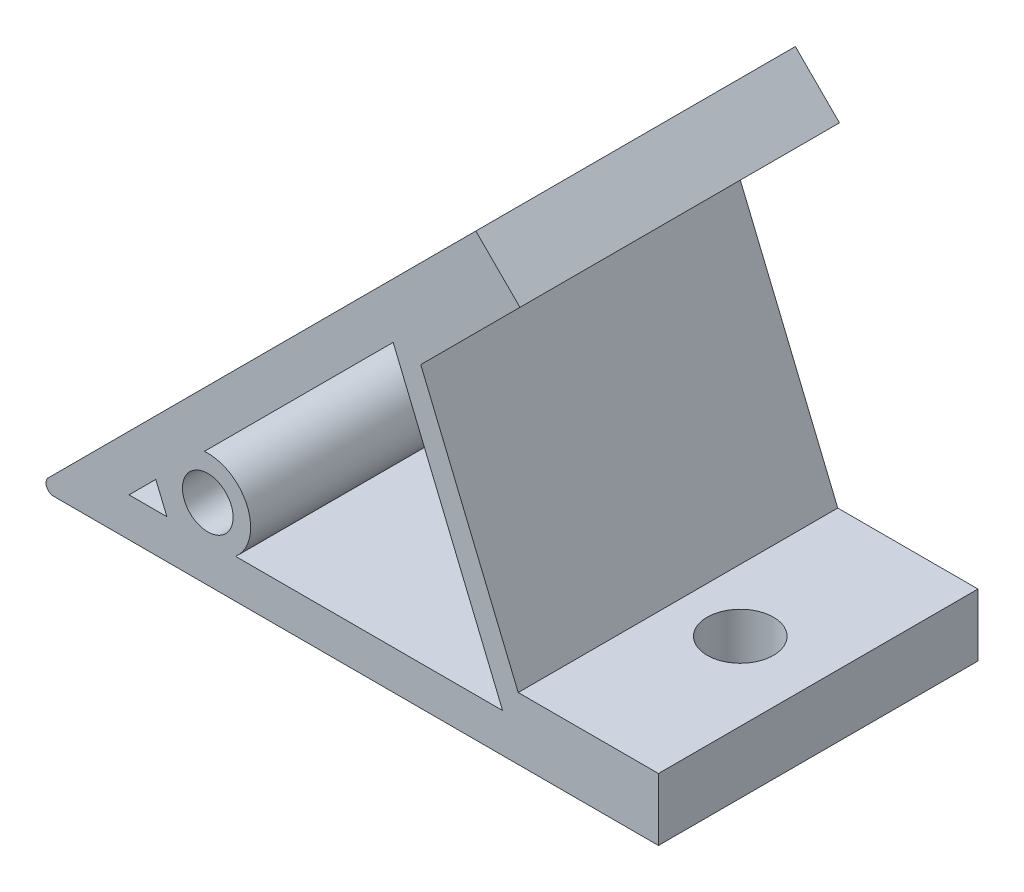
ISO-10303-21;
HEADER;
FILE_DESCRIPTION(('STEP AP214'),'2;1');
FILE_NAME('part.step','',(''),(''),'','','');
FILE_SCHEMA(('AUTOMOTIVE_DESIGN { 1 0 10303 214 1 1 1 1 }'));
ENDSEC;
DATA;
#1=APPLICATION_CONTEXT('core data for automotive mechanical design processes');
#2=APPLICATION_PROTOCOL_DEFINITION('international standard','automotive_design',2000,#1);
#3=PRODUCT_CONTEXT('',#1,'mechanical');
#4=PRODUCT('Part','Part','',(#3));
#5=PRODUCT_RELATED_PRODUCT_CATEGORY('part','',(#4));
#6=PRODUCT_DEFINITION_FORMATION('','',#4);
#7=PRODUCT_DEFINITION_CONTEXT('part definition',#1,'design');
#8=PRODUCT_DEFINITION('design','',#6,#7);
#9=PRODUCT_DEFINITION_SHAPE('','',#8);
#10=(LENGTH_UNIT() NAMED_UNIT(*) SI_UNIT(.MILLI.,.METRE.));
#11=(NAMED_UNIT(*) PLANE_ANGLE_UNIT() SI_UNIT($,.RADIAN.));
#12=(NAMED_UNIT(*) SI_UNIT($,.STERADIAN.) SOLID_ANGLE_UNIT());
#13=UNCERTAINTY_MEASURE_WITH_UNIT(LENGTH_MEASURE(1.E-05),#10,'distance_accuracy_value','');
#14=(GEOMETRIC_REPRESENTATION_CONTEXT(3) GLOBAL_UNCERTAINTY_ASSIGNED_CONTEXT((#13)) GLOBAL_UNIT_ASSIGNED_CONTEXT((#10,
#11,#12)) REPRESENTATION_CONTEXT('',''));
#15=CARTESIAN_POINT('',(0.,0.,0.));
#16=DIRECTION('',(0.,0.,1.));
#17=DIRECTION('',(1.,0.,0.));
#18=AXIS2_PLACEMENT_3D('',#15,#16,#17);
#19=CARTESIAN_POINT('',(-30.4993179415646,38.1869735594505,20.5));
#20=DIRECTION('',(-0.707106781186548,0.707106781186547,0.));
#21=DIRECTION('',(-0.707106781186547,-0.707106781186548,0.));
#22=AXIS2_PLACEMENT_3D('',#19,#20,#21);
#23=PLANE('',#22);
#24=DIRECTION('',(0.707106781186547,0.707106781186548,0.));
#25=VECTOR('',#24,1.);
#26=CARTESIAN_POINT('',(-30.4993179415646,38.1869735594505,-20.5));
#27=LINE('',#26,#25);
#28=CARTESIAN_POINT('',(-30.4993179415646,38.1869735594505,-20.5));
#29=VERTEX_POINT('',#28);
#30=CARTESIAN_POINT('',(-17.7746032555838,50.9116882454314,-20.5));
#31=VERTEX_POINT('',#30);
#32=EDGE_CURVE('E236',#29,#31,#27,.T.);
#33=ORIENTED_EDGE('',*,*,#32,.T.);
#34=DIRECTION('',(0.,0.,-1.));
#35=VECTOR('',#34,1.);
#36=CARTESIAN_POINT('',(-17.7746032555838,50.9116882454314,20.5));
#37=LINE('',#36,#35);
#38=CARTESIAN_POINT('',(-17.7746032555838,50.9116882454314,20.5));
#39=VERTEX_POINT('',#38);
#40=EDGE_CURVE('E246',#39,#31,#37,.T.);
#41=ORIENTED_EDGE('',*,*,#40,.F.);
#42=DIRECTION('',(0.707106781186547,0.707106781186548,0.));
#43=VECTOR('',#42,1.);
#44=CARTESIAN_POINT('',(-30.4993179415646,38.1869735594505,20.5));
#45=LINE('',#44,#43);
#46=CARTESIAN_POINT('',(-30.4993179415646,38.1869735594505,20.5));
#47=VERTEX_POINT('',#46);
#48=EDGE_CURVE('E219',#47,#39,#45,.T.);
#49=ORIENTED_EDGE('',*,*,#48,.F.);
#50=DIRECTION('',(0.,0.,-1.));
#51=VECTOR('',#50,1.);
#52=CARTESIAN_POINT('',(-30.4993179415646,38.1869735594505,20.5));
#53=LINE('',#52,#51);
#54=EDGE_CURVE('E249',#47,#29,#53,.T.);
#55=ORIENTED_EDGE('',*,*,#54,.T.);
#56=EDGE_LOOP('',(#33,#41,#49,#55));
#57=FACE_BOUND('',#56,.T.);
#58=CARTESIAN_POINT('',(-24.8456710674492,43.8406204335659,0.));
#59=DIRECTION('',(-0.70710678118655,0.707106781186545,0.));
#60=DIRECTION('',(-0.707106781186546,-0.707106781186549,0.));
#61=AXIS2_PLACEMENT_3D('',#58,#59,#60);
#62=CIRCLE('',#61,4.25);
#63=CARTESIAN_POINT('',(-27.850874887492,40.8354166135231,0.));
#64=VERTEX_POINT('',#63);
#65=EDGE_CURVE('E305',#64,#64,#62,.T.);
#66=ORIENTED_EDGE('',*,*,#65,.T.);
#67=EDGE_LOOP('',(#66));
#68=FACE_BOUND('',#67,.T.);
#69=ADVANCED_FACE('F35',(#57,#68),#23,.F.);
#70=CARTESIAN_POINT('',(-78.2928932188134,1.7071067811866,20.5));
#71=DIRECTION('',(0.707106781186548,-0.707106781186547,0.));
#72=DIRECTION('',(0.707106781186547,0.707106781186548,0.));
#73=AXIS2_PLACEMENT_3D('',#70,#71,#72);
#74=PLANE('',#73);
#75=DIRECTION('',(-0.707106781186547,-0.707106781186548,0.));
#76=VECTOR('',#75,1.);
#77=CARTESIAN_POINT('',(-78.2928932188134,1.7071067811866,-20.5));
#78=LINE('',#77,#76);
#79=CARTESIAN_POINT('',(-23.4314575050762,56.5685424949238,-20.5));
#80=VERTEX_POINT('',#79);
#81=CARTESIAN_POINT('',(-78.2928932188134,1.7071067811866,-20.5));
#82=VERTEX_POINT('',#81);
#83=EDGE_CURVE('E211',#80,#82,#78,.T.);
#84=ORIENTED_EDGE('',*,*,#83,.T.);
#85=DIRECTION('',(0.,0.,-1.));
#86=VECTOR('',#85,1.);
#87=CARTESIAN_POINT('',(-78.2928932188134,1.7071067811866,20.5));
#88=LINE('',#87,#86);
#89=CARTESIAN_POINT('',(-78.2928932188134,1.7071067811866,20.5));
#90=VERTEX_POINT('',#89);
#91=EDGE_CURVE('E225',#90,#82,#88,.T.);
#92=ORIENTED_EDGE('',*,*,#91,.F.);
#93=DIRECTION('',(-0.707106781186547,-0.707106781186548,0.));
#94=VECTOR('',#93,1.);
#95=CARTESIAN_POINT('',(-78.2928932188134,1.7071067811866,20.5));
#96=LINE('',#95,#94);
#97=CARTESIAN_POINT('',(-23.4314575050762,56.5685424949238,20.5));
#98=VERTEX_POINT('',#97);
#99=EDGE_CURVE('E223',#98,#90,#96,.T.);
#100=ORIENTED_EDGE('',*,*,#99,.F.);
#101=DIRECTION('',(0.,0.,-1.));
#102=VECTOR('',#101,1.);
#103=CARTESIAN_POINT('',(-23.4314575050762,56.5685424949238,20.5));
#104=LINE('',#103,#102);
#105=EDGE_CURVE('E243',#98,#80,#104,.T.);
#106=ORIENTED_EDGE('',*,*,#105,.T.);
#107=EDGE_LOOP('',(#84,#92,#100,#106));
#108=FACE_BOUND('',#107,.T.);
#109=CARTESIAN_POINT('',(-30.5025253169417,49.4974746830583,0.));
#110=DIRECTION('',(0.707106781186548,-0.707106781186547,0.));
#111=DIRECTION('',(0.707106781186547,0.707106781186548,0.));
#112=AXIS2_PLACEMENT_3D('',#109,#110,#111);
#113=CIRCLE('',#112,4.25);
#114=CARTESIAN_POINT('',(-27.4973214968988,52.5026785031012,0.));
#115=VERTEX_POINT('',#114);
#116=EDGE_CURVE('E39',#115,#115,#113,.F.);
#117=ORIENTED_EDGE('',*,*,#116,.F.);
#118=EDGE_LOOP('',(#117));
#119=FACE_BOUND('',#118,.T.);
#120=ADVANCED_FACE('F292',(#108,#119),#74,.F.);
#121=CARTESIAN_POINT('',(-77.5857864376269,1.,20.5));
#122=DIRECTION('',(0.,0.,1.));
#123=DIRECTION('',(1.,0.,0.));
#124=AXIS2_PLACEMENT_3D('',#121,#122,#123);
#125=PLANE('',#124);
#126=DIRECTION('',(1.,0.,0.));
#127=VECTOR('',#126,1.);
#128=CARTESIAN_POINT('',(-54.2574687525298,5.,20.5));
#129=LINE('',#128,#127);
#130=CARTESIAN_POINT('',(-54.2574687525298,5.,20.5));
#131=VERTEX_POINT('',#130);
#132=CARTESIAN_POINT('',(-20.,5.,20.5));
#133=VERTEX_POINT('',#132);
#134=EDGE_CURVE('E151',#131,#133,#129,.T.);
#135=ORIENTED_EDGE('',*,*,#134,.F.);
#136=CARTESIAN_POINT('',(-57.8268912197291,9.18440237676214,20.5));
#137=DIRECTION('',(0.,0.,-1.));
#138=DIRECTION('',(1.,0.,0.));
#139=AXIS2_PLACEMENT_3D('',#136,#137,#138);
#140=CIRCLE('',#139,5.49999999999996);
#141=CARTESIAN_POINT('',(-58.2617476840749,14.6671845040599,20.5));
#142=VERTEX_POINT('',#141);
#143=EDGE_CURVE('E143',#142,#131,#140,.T.);
#144=ORIENTED_EDGE('',*,*,#143,.F.);
#145=DIRECTION('',(-0.707106781186549,-0.707106781186546,0.));
#146=VECTOR('',#145,1.);
#147=CARTESIAN_POINT('',(-58.2617476840749,14.6671845040599,20.5));
#148=LINE('',#147,#146);
#149=CARTESIAN_POINT('',(-34.0380592228744,38.8908729652603,20.5));
#150=VERTEX_POINT('',#149);
#151=EDGE_CURVE('E167',#150,#142,#148,.T.);
#152=ORIENTED_EDGE('',*,*,#151,.F.);
#153=DIRECTION('',(-0.382683432365087,0.923879532511288,0.));
#154=VECTOR('',#153,1.);
#155=CARTESIAN_POINT('',(-20.,5.,20.5));
#156=LINE('',#155,#154);
#157=EDGE_CURVE('E165',#133,#150,#156,.T.);
#158=ORIENTED_EDGE('',*,*,#157,.F.);
#159=EDGE_LOOP('',(#135,#144,#152,#158));
#160=FACE_BOUND('',#159,.T.);
#161=CARTESIAN_POINT('',(-77.5857864376269,1.,20.5));
#162=DIRECTION('',(0.,0.,1.));
#163=DIRECTION('',(1.,0.,0.));
#164=AXIS2_PLACEMENT_3D('',#161,#162,#163);
#165=CIRCLE('',#164,1.);
#166=CARTESIAN_POINT('',(-77.5857864376269,0.,20.5));
#167=VERTEX_POINT('',#166);
#168=EDGE_CURVE('E207',#90,#167,#165,.T.);
#169=ORIENTED_EDGE('',*,*,#168,.T.);
#170=DIRECTION('',(1.,0.,0.));
#171=VECTOR('',#170,1.);
#172=CARTESIAN_POINT('',(-77.5857864376269,0.,20.5));
#173=LINE('',#172,#171);
#174=CARTESIAN_POINT('',(0.,0.,20.5));
#175=VERTEX_POINT('',#174);
#176=EDGE_CURVE('E210',#167,#175,#173,.T.);
#177=ORIENTED_EDGE('',*,*,#176,.T.);
#178=DIRECTION('',(0.,1.,0.));
#179=VECTOR('',#178,1.);
#180=CARTESIAN_POINT('',(0.,0.,20.5));
#181=LINE('',#180,#179);
#182=CARTESIAN_POINT('',(0.,8.,20.5));
#183=VERTEX_POINT('',#182);
#184=EDGE_CURVE('E213',#175,#183,#181,.T.);
#185=ORIENTED_EDGE('',*,*,#184,.T.);
#186=DIRECTION('',(-1.,0.,0.));
#187=VECTOR('',#186,1.);
#188=CARTESIAN_POINT('',(-17.995464086242,8.00000000000012,20.5));
#189=LINE('',#188,#187);
#190=CARTESIAN_POINT('',(-17.995464086242,8.00000000000012,20.5));
#191=VERTEX_POINT('',#190);
#192=EDGE_CURVE('E215',#183,#191,#189,.T.);
#193=ORIENTED_EDGE('',*,*,#192,.T.);
#194=DIRECTION('',(-0.382683432365096,0.923879532511284,0.));
#195=VECTOR('',#194,1.);
#196=CARTESIAN_POINT('',(-17.995464086242,8.00000000000012,20.5));
#197=LINE('',#196,#195);
#198=EDGE_CURVE('E217',#191,#47,#197,.T.);
#199=ORIENTED_EDGE('',*,*,#198,.T.);
#200=ORIENTED_EDGE('',*,*,#48,.T.);
#201=DIRECTION('',(-0.707106781186548,0.707106781186547,0.));
#202=VECTOR('',#201,1.);
#203=CARTESIAN_POINT('',(-17.7746032555838,50.9116882454314,20.5));
#204=LINE('',#203,#202);
#205=EDGE_CURVE('E221',#39,#98,#204,.T.);
#206=ORIENTED_EDGE('',*,*,#205,.T.);
#207=ORIENTED_EDGE('',*,*,#99,.T.);
#208=EDGE_LOOP('',(#169,#177,#185,#193,#199,#200,#206,#207));
#209=FACE_BOUND('',#208,.T.);
#210=DIRECTION('',(1.,0.,0.));
#211=VECTOR('',#210,1.);
#212=CARTESIAN_POINT('',(-67.9289321881347,5.,20.5));
#213=LINE('',#212,#211);
#214=CARTESIAN_POINT('',(-67.9289321881347,5.,20.5));
#215=VERTEX_POINT('',#214);
#216=CARTESIAN_POINT('',(-63.0744704704145,5.00000000000011,20.5));
#217=VERTEX_POINT('',#216);
#218=EDGE_CURVE('E185',#215,#217,#213,.T.);
#219=ORIENTED_EDGE('',*,*,#218,.F.);
#220=DIRECTION('',(-0.70710678118656,-0.707106781186535,0.));
#221=VECTOR('',#220,1.);
#222=CARTESIAN_POINT('',(-67.9289321881347,5.,20.5));
#223=LINE('',#222,#221);
#224=CARTESIAN_POINT('',(-64.4963093885244,8.43262279961016,20.5));
#225=VERTEX_POINT('',#224);
#226=EDGE_CURVE('E183',#225,#215,#223,.T.);
#227=ORIENTED_EDGE('',*,*,#226,.F.);
#228=DIRECTION('',(-0.382683432365157,0.923879532511259,0.));
#229=VECTOR('',#228,1.);
#230=CARTESIAN_POINT('',(-63.0744704704145,5.00000000000011,20.5));
#231=LINE('',#230,#229);
#232=EDGE_CURVE('E189',#217,#225,#231,.T.);
#233=ORIENTED_EDGE('',*,*,#232,.F.);
#234=EDGE_LOOP('',(#219,#227,#233));
#235=FACE_BOUND('',#234,.T.);
#236=CARTESIAN_POINT('',(-57.8268912197291,9.18440237676214,20.5));
#237=DIRECTION('',(0.,0.,1.));
#238=DIRECTION('',(1.,0.,0.));
#239=AXIS2_PLACEMENT_3D('',#236,#237,#238);
#240=CIRCLE('',#239,3.25);
#241=CARTESIAN_POINT('',(-54.5768912197291,9.18440237676214,20.5));
#242=VERTEX_POINT('',#241);
#243=EDGE_CURVE('E173',#242,#242,#240,.T.);
#244=ORIENTED_EDGE('',*,*,#243,.F.);
#245=EDGE_LOOP('',(#244));
#246=FACE_BOUND('',#245,.T.);
#247=ADVANCED_FACE('F163',(#160,#209,#235,#246),#125,.T.);
#248=CARTESIAN_POINT('',(-77.5857864376269,1.,-20.5));
#249=DIRECTION('',(0.,0.,1.));
#250=DIRECTION('',(1.,0.,0.));
#251=AXIS2_PLACEMENT_3D('',#248,#249,#250);
#252=PLANE('',#251);
#253=CARTESIAN_POINT('',(-57.8268912197291,9.18440237676214,-20.5));
#254=DIRECTION('',(0.,0.,-1.));
#255=DIRECTION('',(1.,0.,0.));
#256=AXIS2_PLACEMENT_3D('',#253,#254,#255);
#257=CIRCLE('',#256,5.49999999999996);
#258=CARTESIAN_POINT('',(-58.2617476840749,14.6671845040599,-20.5));
#259=VERTEX_POINT('',#258);
#260=CARTESIAN_POINT('',(-54.2574687525298,5.,-20.5));
#261=VERTEX_POINT('',#260);
#262=EDGE_CURVE('E59',#259,#261,#257,.T.);
#263=ORIENTED_EDGE('',*,*,#262,.T.);
#264=DIRECTION('',(1.,0.,0.));
#265=VECTOR('',#264,1.);
#266=CARTESIAN_POINT('',(-54.2574687525298,5.,-20.5));
#267=LINE('',#266,#265);
#268=CARTESIAN_POINT('',(-20.,5.,-20.5));
#269=VERTEX_POINT('',#268);
#270=EDGE_CURVE('E158',#261,#269,#267,.T.);
#271=ORIENTED_EDGE('',*,*,#270,.T.);
#272=DIRECTION('',(-0.382683432365087,0.923879532511288,0.));
#273=VECTOR('',#272,1.);
#274=CARTESIAN_POINT('',(-20.,5.,-20.5));
#275=LINE('',#274,#273);
#276=CARTESIAN_POINT('',(-34.0380592228744,38.8908729652603,-20.5));
#277=VERTEX_POINT('',#276);
#278=EDGE_CURVE('E175',#269,#277,#275,.T.);
#279=ORIENTED_EDGE('',*,*,#278,.T.);
#280=DIRECTION('',(-0.707106781186549,-0.707106781186546,0.));
#281=VECTOR('',#280,1.);
#282=CARTESIAN_POINT('',(-58.2617476840749,14.6671845040599,-20.5));
#283=LINE('',#282,#281);
#284=EDGE_CURVE('E152',#277,#259,#283,.T.);
#285=ORIENTED_EDGE('',*,*,#284,.T.);
#286=EDGE_LOOP('',(#263,#271,#279,#285));
#287=FACE_BOUND('',#286,.T.);
#288=CARTESIAN_POINT('',(-77.5857864376269,1.,-20.5));
#289=DIRECTION('',(0.,0.,1.));
#290=DIRECTION('',(1.,0.,0.));
#291=AXIS2_PLACEMENT_3D('',#288,#289,#290);
#292=CIRCLE('',#291,1.);
#293=CARTESIAN_POINT('',(-77.5857864376269,0.,-20.5));
#294=VERTEX_POINT('',#293);
#295=EDGE_CURVE('E206',#82,#294,#292,.T.);
#296=ORIENTED_EDGE('',*,*,#295,.F.);
#297=ORIENTED_EDGE('',*,*,#83,.F.);
#298=DIRECTION('',(-0.707106781186548,0.707106781186547,0.));
#299=VECTOR('',#298,1.);
#300=CARTESIAN_POINT('',(-17.7746032555838,50.9116882454314,-20.5));
#301=LINE('',#300,#299);
#302=EDGE_CURVE('E238',#31,#80,#301,.T.);
#303=ORIENTED_EDGE('',*,*,#302,.F.);
#304=ORIENTED_EDGE('',*,*,#32,.F.);
#305=DIRECTION('',(-0.382683432365096,0.923879532511284,0.));
#306=VECTOR('',#305,1.);
#307=CARTESIAN_POINT('',(-17.995464086242,8.00000000000012,-20.5));
#308=LINE('',#307,#306);
#309=CARTESIAN_POINT('',(-17.995464086242,8.00000000000012,-20.5));
#310=VERTEX_POINT('',#309);
#311=EDGE_CURVE('E234',#310,#29,#308,.T.);
#312=ORIENTED_EDGE('',*,*,#311,.F.);
#313=DIRECTION('',(-1.,0.,0.));
#314=VECTOR('',#313,1.);
#315=CARTESIAN_POINT('',(-17.995464086242,8.00000000000012,-20.5));
#316=LINE('',#315,#314);
#317=CARTESIAN_POINT('',(0.,8.,-20.5));
#318=VERTEX_POINT('',#317);
#319=EDGE_CURVE('E232',#318,#310,#316,.T.);
#320=ORIENTED_EDGE('',*,*,#319,.F.);
#321=DIRECTION('',(0.,1.,0.));
#322=VECTOR('',#321,1.);
#323=CARTESIAN_POINT('',(0.,0.,-20.5));
#324=LINE('',#323,#322);
#325=CARTESIAN_POINT('',(0.,0.,-20.5));
#326=VERTEX_POINT('',#325);
#327=EDGE_CURVE('E230',#326,#318,#324,.T.);
#328=ORIENTED_EDGE('',*,*,#327,.F.);
#329=DIRECTION('',(1.,0.,0.));
#330=VECTOR('',#329,1.);
#331=CARTESIAN_POINT('',(-77.5857864376269,0.,-20.5));
#332=LINE('',#331,#330);
#333=EDGE_CURVE('E228',#294,#326,#332,.T.);
#334=ORIENTED_EDGE('',*,*,#333,.F.);
#335=EDGE_LOOP('',(#296,#297,#303,#304,#312,#320,#328,#334));
#336=FACE_BOUND('',#335,.T.);
#337=DIRECTION('',(-0.70710678118656,-0.707106781186535,0.));
#338=VECTOR('',#337,1.);
#339=CARTESIAN_POINT('',(-67.9289321881347,5.,-20.5));
#340=LINE('',#339,#338);
#341=CARTESIAN_POINT('',(-64.4963093885244,8.43262279961016,-20.5));
#342=VERTEX_POINT('',#341);
#343=CARTESIAN_POINT('',(-67.9289321881347,5.,-20.5));
#344=VERTEX_POINT('',#343);
#345=EDGE_CURVE('E159',#342,#344,#340,.T.);
#346=ORIENTED_EDGE('',*,*,#345,.T.);
#347=DIRECTION('',(1.,0.,0.));
#348=VECTOR('',#347,1.);
#349=CARTESIAN_POINT('',(-67.9289321881347,5.,-20.5));
#350=LINE('',#349,#348);
#351=CARTESIAN_POINT('',(-63.0744704704145,5.00000000000011,-20.5));
#352=VERTEX_POINT('',#351);
#353=EDGE_CURVE('E194',#344,#352,#350,.T.);
#354=ORIENTED_EDGE('',*,*,#353,.T.);
#355=DIRECTION('',(-0.382683432365157,0.923879532511259,0.));
#356=VECTOR('',#355,1.);
#357=CARTESIAN_POINT('',(-63.0744704704145,5.00000000000011,-20.5));
#358=LINE('',#357,#356);
#359=EDGE_CURVE('E186',#352,#342,#358,.T.);
#360=ORIENTED_EDGE('',*,*,#359,.T.);
#361=EDGE_LOOP('',(#346,#354,#360));
#362=FACE_BOUND('',#361,.T.);
#363=CARTESIAN_POINT('',(-57.8268912197291,9.18440237676214,-20.5));
#364=DIRECTION('',(0.,0.,1.));
#365=DIRECTION('',(1.,0.,0.));
#366=AXIS2_PLACEMENT_3D('',#363,#364,#365);
#367=CIRCLE('',#366,3.25);
#368=CARTESIAN_POINT('',(-54.5768912197291,9.18440237676214,-20.5));
#369=VERTEX_POINT('',#368);
#370=EDGE_CURVE('E316',#369,#369,#367,.T.);
#371=ORIENTED_EDGE('',*,*,#370,.T.);
#372=EDGE_LOOP('',(#371));
#373=FACE_BOUND('',#372,.T.);
#374=ADVANCED_FACE('F269',(#287,#336,#362,#373),#252,.F.);
#375=CARTESIAN_POINT('',(-77.5857864376269,1.,20.5));
#376=DIRECTION('',(0.,0.,-1.));
#377=DIRECTION('',(-1.,0.,0.));
#378=AXIS2_PLACEMENT_3D('',#375,#376,#377);
#379=CYLINDRICAL_SURFACE('',#378,1.);
#380=ORIENTED_EDGE('',*,*,#295,.T.);
#381=DIRECTION('',(0.,0.,-1.));
#382=VECTOR('',#381,1.);
#383=CARTESIAN_POINT('',(-77.5857864376269,0.,20.5));
#384=LINE('',#383,#382);
#385=EDGE_CURVE('E11',#167,#294,#384,.T.);
#386=ORIENTED_EDGE('',*,*,#385,.F.);
#387=ORIENTED_EDGE('',*,*,#168,.F.);
#388=ORIENTED_EDGE('',*,*,#91,.T.);
#389=EDGE_LOOP('',(#380,#386,#387,#388));
#390=FACE_BOUND('',#389,.T.);
#391=ADVANCED_FACE('F37',(#390),#379,.T.);
#392=CARTESIAN_POINT('',(-77.5857864376269,0.,20.5));
#393=DIRECTION('',(0.,1.,0.));
#394=DIRECTION('',(0.,0.,1.));
#395=AXIS2_PLACEMENT_3D('',#392,#393,#394);
#396=PLANE('',#395);
#397=CARTESIAN_POINT('',(-10.,0.,0.));
#398=DIRECTION('',(0.,1.,0.));
#399=DIRECTION('',(0.,0.,1.));
#400=AXIS2_PLACEMENT_3D('',#397,#398,#399);
#401=CIRCLE('',#400,4.25);
#402=CARTESIAN_POINT('',(-10.,0.,4.25));
#403=VERTEX_POINT('',#402);
#404=EDGE_CURVE('E313',#403,#403,#401,.T.);
#405=ORIENTED_EDGE('',*,*,#404,.T.);
#406=EDGE_LOOP('',(#405));
#407=FACE_BOUND('',#406,.T.);
#408=ORIENTED_EDGE('',*,*,#333,.T.);
#409=DIRECTION('',(0.,0.,-1.));
#410=VECTOR('',#409,1.);
#411=CARTESIAN_POINT('',(0.,0.,20.5));
#412=LINE('',#411,#410);
#413=EDGE_CURVE('E44',#175,#326,#412,.T.);
#414=ORIENTED_EDGE('',*,*,#413,.F.);
#415=ORIENTED_EDGE('',*,*,#176,.F.);
#416=ORIENTED_EDGE('',*,*,#385,.T.);
#417=EDGE_LOOP('',(#408,#414,#415,#416));
#418=FACE_BOUND('',#417,.T.);
#419=ADVANCED_FACE('F286',(#407,#418),#396,.F.);
#420=CARTESIAN_POINT('',(0.,0.,20.5));
#421=DIRECTION('',(-1.,0.,0.));
#422=DIRECTION('',(0.,0.,1.));
#423=AXIS2_PLACEMENT_3D('',#420,#421,#422);
#424=PLANE('',#423);
#425=ORIENTED_EDGE('',*,*,#327,.T.);
#426=DIRECTION('',(0.,0.,-1.));
#427=VECTOR('',#426,1.);
#428=CARTESIAN_POINT('',(0.,8.,20.5));
#429=LINE('',#428,#427);
#430=EDGE_CURVE('E255',#183,#318,#429,.T.);
#431=ORIENTED_EDGE('',*,*,#430,.F.);
#432=ORIENTED_EDGE('',*,*,#184,.F.);
#433=ORIENTED_EDGE('',*,*,#413,.T.);
#434=EDGE_LOOP('',(#425,#431,#432,#433));
#435=FACE_BOUND('',#434,.T.);
#436=ADVANCED_FACE('F263',(#435),#424,.F.);
#437=CARTESIAN_POINT('',(-17.995464086242,8.00000000000012,20.5));
#438=DIRECTION('',(0.,-1.,0.));
#439=DIRECTION('',(1.,0.,0.));
#440=AXIS2_PLACEMENT_3D('',#437,#438,#439);
#441=PLANE('',#440);
#442=CARTESIAN_POINT('',(-10.,8.00000000000006,0.));
#443=DIRECTION('',(0.,1.,0.));
#444=DIRECTION('',(-1.,0.,0.));
#445=AXIS2_PLACEMENT_3D('',#442,#443,#444);
#446=CIRCLE('',#445,4.25);
#447=CARTESIAN_POINT('',(-14.25,8.00000000000009,0.));
#448=VERTEX_POINT('',#447);
#449=EDGE_CURVE('E309',#448,#448,#446,.T.);
#450=ORIENTED_EDGE('',*,*,#449,.F.);
#451=EDGE_LOOP('',(#450));
#452=FACE_BOUND('',#451,.T.);
#453=ORIENTED_EDGE('',*,*,#319,.T.);
#454=DIRECTION('',(0.,0.,-1.));
#455=VECTOR('',#454,1.);
#456=CARTESIAN_POINT('',(-17.995464086242,8.00000000000012,20.5));
#457=LINE('',#456,#455);
#458=EDGE_CURVE('E252',#191,#310,#457,.T.);
#459=ORIENTED_EDGE('',*,*,#458,.F.);
#460=ORIENTED_EDGE('',*,*,#192,.F.);
#461=ORIENTED_EDGE('',*,*,#430,.T.);
#462=EDGE_LOOP('',(#453,#459,#460,#461));
#463=FACE_BOUND('',#462,.T.);
#464=ADVANCED_FACE('F275',(#452,#463),#441,.F.);
#465=CARTESIAN_POINT('',(-17.995464086242,8.00000000000012,20.5));
#466=DIRECTION('',(-0.923879532511284,-0.382683432365097,0.));
#467=DIRECTION('',(0.382683432365097,-0.923879532511284,0.));
#468=AXIS2_PLACEMENT_3D('',#465,#466,#467);
#469=PLANE('',#468);
#470=ORIENTED_EDGE('',*,*,#311,.T.);
#471=ORIENTED_EDGE('',*,*,#54,.F.);
#472=ORIENTED_EDGE('',*,*,#198,.F.);
#473=ORIENTED_EDGE('',*,*,#458,.T.);
#474=EDGE_LOOP('',(#470,#471,#472,#473));
#475=FACE_BOUND('',#474,.T.);
#476=ADVANCED_FACE('F279',(#475),#469,.F.);
#477=CARTESIAN_POINT('',(-17.7746032555838,50.9116882454314,20.5));
#478=DIRECTION('',(-0.707106781186547,-0.707106781186548,0.));
#479=DIRECTION('',(0.707106781186548,-0.707106781186547,0.));
#480=AXIS2_PLACEMENT_3D('',#477,#478,#479);
#481=PLANE('',#480);
#482=ORIENTED_EDGE('',*,*,#302,.T.);
#483=ORIENTED_EDGE('',*,*,#105,.F.);
#484=ORIENTED_EDGE('',*,*,#205,.F.);
#485=ORIENTED_EDGE('',*,*,#40,.T.);
#486=EDGE_LOOP('',(#482,#483,#484,#485));
#487=FACE_BOUND('',#486,.T.);
#488=ADVANCED_FACE('F298',(#487),#481,.F.);
#489=CARTESIAN_POINT('',(-67.9289321881347,5.,20.5));
#490=DIRECTION('',(0.707106781186535,-0.70710678118656,0.));
#491=DIRECTION('',(0.70710678118656,0.707106781186535,0.));
#492=AXIS2_PLACEMENT_3D('',#489,#490,#491);
#493=PLANE('',#492);
#494=ORIENTED_EDGE('',*,*,#345,.F.);
#495=DIRECTION('',(0.,0.,-1.));
#496=VECTOR('',#495,1.);
#497=CARTESIAN_POINT('',(-64.4963093885244,8.43262279961016,20.5));
#498=LINE('',#497,#496);
#499=EDGE_CURVE('E191',#225,#342,#498,.T.);
#500=ORIENTED_EDGE('',*,*,#499,.F.);
#501=ORIENTED_EDGE('',*,*,#226,.T.);
#502=DIRECTION('',(0.,0.,-1.));
#503=VECTOR('',#502,1.);
#504=CARTESIAN_POINT('',(-67.9289321881347,5.,20.5));
#505=LINE('',#504,#503);
#506=EDGE_CURVE('E203',#215,#344,#505,.T.);
#507=ORIENTED_EDGE('',*,*,#506,.T.);
#508=EDGE_LOOP('',(#494,#500,#501,#507));
#509=FACE_BOUND('',#508,.T.);
#510=ADVANCED_FACE('F353',(#509),#493,.T.);
#511=CARTESIAN_POINT('',(-67.9289321881347,5.,20.5));
#512=DIRECTION('',(0.,1.,0.));
#513=DIRECTION('',(-1.,0.,0.));
#514=AXIS2_PLACEMENT_3D('',#511,#512,#513);
#515=PLANE('',#514);
#516=ORIENTED_EDGE('',*,*,#353,.F.);
#517=ORIENTED_EDGE('',*,*,#506,.F.);
#518=ORIENTED_EDGE('',*,*,#218,.T.);
#519=DIRECTION('',(0.,0.,-1.));
#520=VECTOR('',#519,1.);
#521=CARTESIAN_POINT('',(-63.0744704704145,5.00000000000011,20.5));
#522=LINE('',#521,#520);
#523=EDGE_CURVE('E201',#217,#352,#522,.T.);
#524=ORIENTED_EDGE('',*,*,#523,.T.);
#525=EDGE_LOOP('',(#516,#517,#518,#524));
#526=FACE_BOUND('',#525,.T.);
#527=ADVANCED_FACE('F349',(#526),#515,.T.);
#528=CARTESIAN_POINT('',(-63.0744704704145,5.00000000000011,20.5));
#529=DIRECTION('',(-0.923879532511259,-0.382683432365157,0.));
#530=DIRECTION('',(0.382683432365157,-0.923879532511259,0.));
#531=AXIS2_PLACEMENT_3D('',#528,#529,#530);
#532=PLANE('',#531);
#533=ORIENTED_EDGE('',*,*,#359,.F.);
#534=ORIENTED_EDGE('',*,*,#523,.F.);
#535=ORIENTED_EDGE('',*,*,#232,.T.);
#536=ORIENTED_EDGE('',*,*,#499,.T.);
#537=EDGE_LOOP('',(#533,#534,#535,#536));
#538=FACE_BOUND('',#537,.T.);
#539=ADVANCED_FACE('F346',(#538),#532,.T.);
#540=CARTESIAN_POINT('',(-57.8268912197291,9.18440237676214,20.5));
#541=DIRECTION('',(0.,0.,-1.));
#542=DIRECTION('',(-1.,0.,0.));
#543=AXIS2_PLACEMENT_3D('',#540,#541,#542);
#544=CYLINDRICAL_SURFACE('',#543,5.49999999999996);
#545=ORIENTED_EDGE('',*,*,#262,.F.);
#546=DIRECTION('',(0.,0.,-1.));
#547=VECTOR('',#546,1.);
#548=CARTESIAN_POINT('',(-58.2617476840749,14.6671845040599,20.5));
#549=LINE('',#548,#547);
#550=EDGE_CURVE('E147',#142,#259,#549,.T.);
#551=ORIENTED_EDGE('',*,*,#550,.F.);
#552=ORIENTED_EDGE('',*,*,#143,.T.);
#553=DIRECTION('',(0.,0.,-1.));
#554=VECTOR('',#553,1.);
#555=CARTESIAN_POINT('',(-54.2574687525298,5.,20.5));
#556=LINE('',#555,#554);
#557=EDGE_CURVE('E146',#131,#261,#556,.T.);
#558=ORIENTED_EDGE('',*,*,#557,.T.);
#559=EDGE_LOOP('',(#545,#551,#552,#558));
#560=FACE_BOUND('',#559,.T.);
#561=ADVANCED_FACE('F145',(#560),#544,.T.);
#562=CARTESIAN_POINT('',(-54.2574687525298,5.,20.5));
#563=DIRECTION('',(0.,1.,0.));
#564=DIRECTION('',(0.,0.,1.));
#565=AXIS2_PLACEMENT_3D('',#562,#563,#564);
#566=PLANE('',#565);
#567=ORIENTED_EDGE('',*,*,#270,.F.);
#568=ORIENTED_EDGE('',*,*,#557,.F.);
#569=ORIENTED_EDGE('',*,*,#134,.T.);
#570=DIRECTION('',(0.,0.,-1.));
#571=VECTOR('',#570,1.);
#572=CARTESIAN_POINT('',(-20.,5.,20.5));
#573=LINE('',#572,#571);
#574=EDGE_CURVE('E160',#133,#269,#573,.T.);
#575=ORIENTED_EDGE('',*,*,#574,.T.);
#576=EDGE_LOOP('',(#567,#568,#569,#575));
#577=FACE_BOUND('',#576,.T.);
#578=ADVANCED_FACE('F155',(#577),#566,.T.);
#579=CARTESIAN_POINT('',(-20.,5.,20.5));
#580=DIRECTION('',(-0.923879532511288,-0.382683432365087,0.));
#581=DIRECTION('',(0.382683432365087,-0.923879532511288,0.));
#582=AXIS2_PLACEMENT_3D('',#579,#580,#581);
#583=PLANE('',#582);
#584=ORIENTED_EDGE('',*,*,#278,.F.);
#585=ORIENTED_EDGE('',*,*,#574,.F.);
#586=ORIENTED_EDGE('',*,*,#157,.T.);
#587=DIRECTION('',(0.,0.,-1.));
#588=VECTOR('',#587,1.);
#589=CARTESIAN_POINT('',(-34.0380592228744,38.8908729652603,20.5));
#590=LINE('',#589,#588);
#591=EDGE_CURVE('E51',#150,#277,#590,.T.);
#592=ORIENTED_EDGE('',*,*,#591,.T.);
#593=EDGE_LOOP('',(#584,#585,#586,#592));
#594=FACE_BOUND('',#593,.T.);
#595=ADVANCED_FACE('F335',(#594),#583,.T.);
#596=CARTESIAN_POINT('',(-58.2617476840749,14.6671845040599,20.5));
#597=DIRECTION('',(0.707106781186546,-0.707106781186549,0.));
#598=DIRECTION('',(0.707106781186549,0.707106781186546,0.));
#599=AXIS2_PLACEMENT_3D('',#596,#597,#598);
#600=PLANE('',#599);
#601=ORIENTED_EDGE('',*,*,#284,.F.);
#602=ORIENTED_EDGE('',*,*,#591,.F.);
#603=ORIENTED_EDGE('',*,*,#151,.T.);
#604=ORIENTED_EDGE('',*,*,#550,.T.);
#605=EDGE_LOOP('',(#601,#602,#603,#604));
#606=FACE_BOUND('',#605,.T.);
#607=ADVANCED_FACE('F325',(#606),#600,.T.);
#608=CARTESIAN_POINT('',(-57.8268912197291,9.18440237676214,20.5));
#609=DIRECTION('',(0.,0.,-1.));
#610=DIRECTION('',(-1.,0.,0.));
#611=AXIS2_PLACEMENT_3D('',#608,#609,#610);
#612=CYLINDRICAL_SURFACE('',#611,3.25);
#613=ORIENTED_EDGE('',*,*,#243,.T.);
#614=EDGE_LOOP('',(#613));
#615=FACE_BOUND('',#614,.T.);
#616=ORIENTED_EDGE('',*,*,#370,.F.);
#617=EDGE_LOOP('',(#616));
#618=FACE_BOUND('',#617,.T.);
#619=ADVANCED_FACE('F322',(#615,#618),#612,.F.);
#620=CARTESIAN_POINT('',(-10.0000000000001,-8.99999999999994,0.));
#621=DIRECTION('',(0.,1.,0.));
#622=DIRECTION('',(-1.,0.,0.));
#623=AXIS2_PLACEMENT_3D('',#620,#621,#622);
#624=CYLINDRICAL_SURFACE('',#623,4.25);
#625=ORIENTED_EDGE('',*,*,#449,.T.);
#626=EDGE_LOOP('',(#625));
#627=FACE_BOUND('',#626,.T.);
#628=ORIENTED_EDGE('',*,*,#404,.F.);
#629=EDGE_LOOP('',(#628));
#630=FACE_BOUND('',#629,.T.);
#631=ADVANCED_FACE('F324',(#627,#630),#624,.F.);
#632=CARTESIAN_POINT('',(-36.8664863476205,55.8614357137372,0.));
#633=DIRECTION('',(0.70710678118655,-0.707106781186545,0.));
#634=DIRECTION('',(0.707106781186545,0.70710678118655,0.));
#635=AXIS2_PLACEMENT_3D('',#632,#633,#634);
#636=CYLINDRICAL_SURFACE('',#635,4.25);
#637=ORIENTED_EDGE('',*,*,#65,.F.);
#638=EDGE_LOOP('',(#637));
#639=FACE_BOUND('',#638,.T.);
#640=ORIENTED_EDGE('',*,*,#116,.T.);
#641=EDGE_LOOP('',(#640));
#642=FACE_BOUND('',#641,.T.);
#643=ADVANCED_FACE('F332',(#639,#642),#636,.F.);
#644=CLOSED_SHELL('',(#69,#120,#247,#374,#391,#419,#436,#464,#476,#488,#510,#527,#539,#561,#578,
#595,#607,#619,#631,#643));
#645=MANIFOLD_SOLID_BREP('B2',#644);
#646=ADVANCED_BREP_SHAPE_REPRESENTATION('',(#18,#645),#14);
#647=SHAPE_DEFINITION_REPRESENTATION(#9,#646);
ENDSEC;
END-ISO-10303-21;
